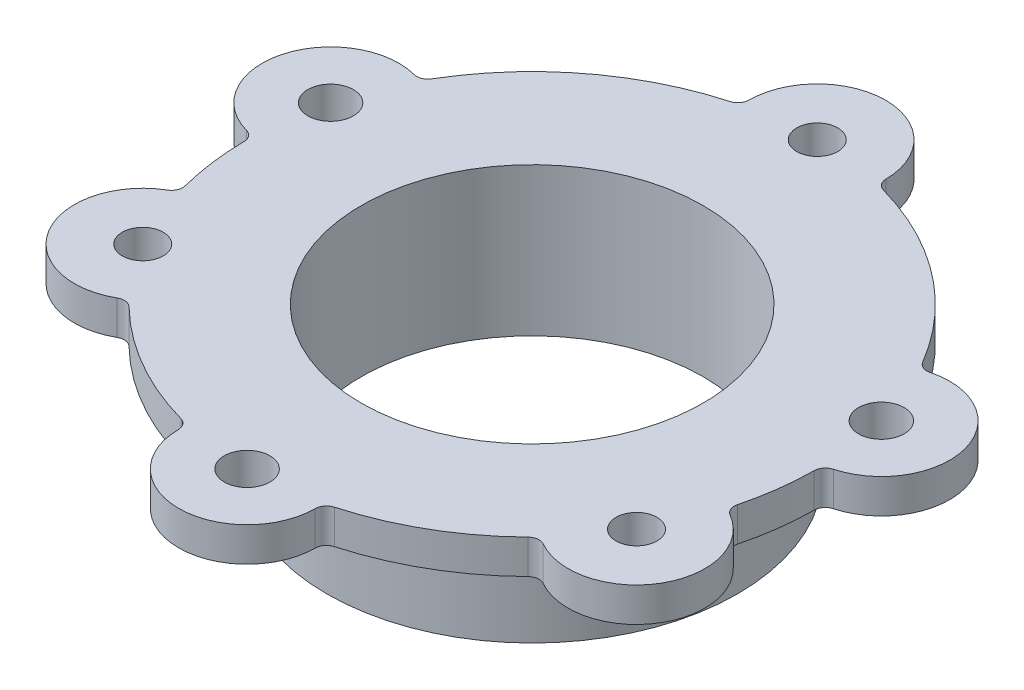
ISO-10303-21;
HEADER;
FILE_DESCRIPTION(('STEP AP214'),'2;1');
FILE_NAME('part.step','',(''),(''),'','','');
FILE_SCHEMA(('AUTOMOTIVE_DESIGN { 1 0 10303 214 1 1 1 1 }'));
ENDSEC;
DATA;
#1=APPLICATION_CONTEXT('core data for automotive mechanical design processes');
#2=APPLICATION_PROTOCOL_DEFINITION('international standard','automotive_design',2000,#1);
#3=PRODUCT_CONTEXT('',#1,'mechanical');
#4=PRODUCT('Part','Part','',(#3));
#5=PRODUCT_RELATED_PRODUCT_CATEGORY('part','',(#4));
#6=PRODUCT_DEFINITION_FORMATION('','',#4);
#7=PRODUCT_DEFINITION_CONTEXT('part definition',#1,'design');
#8=PRODUCT_DEFINITION('design','',#6,#7);
#9=PRODUCT_DEFINITION_SHAPE('','',#8);
#10=(LENGTH_UNIT() NAMED_UNIT(*) SI_UNIT(.MILLI.,.METRE.));
#11=(NAMED_UNIT(*) PLANE_ANGLE_UNIT() SI_UNIT($,.RADIAN.));
#12=(NAMED_UNIT(*) SI_UNIT($,.STERADIAN.) SOLID_ANGLE_UNIT());
#13=UNCERTAINTY_MEASURE_WITH_UNIT(LENGTH_MEASURE(1.E-05),#10,'distance_accuracy_value','');
#14=(GEOMETRIC_REPRESENTATION_CONTEXT(3) GLOBAL_UNCERTAINTY_ASSIGNED_CONTEXT((#13)) GLOBAL_UNIT_ASSIGNED_CONTEXT((#10,
#11,#12)) REPRESENTATION_CONTEXT('',''));
#15=CARTESIAN_POINT('',(0.,0.,0.));
#16=DIRECTION('',(0.,0.,1.));
#17=DIRECTION('',(1.,0.,0.));
#18=AXIS2_PLACEMENT_3D('',#15,#16,#17);
#19=CARTESIAN_POINT('',(0.,0.,0.));
#20=DIRECTION('',(0.,1.,0.));
#21=DIRECTION('',(0.,0.,1.));
#22=AXIS2_PLACEMENT_3D('',#19,#20,#21);
#23=PLANE('',#22);
#24=CARTESIAN_POINT('',(-12.0740728286134,0.,-3.23523806378147));
#25=DIRECTION('',(0.,1.,0.));
#26=DIRECTION('',(0.,0.,1.));
#27=AXIS2_PLACEMENT_3D('',#24,#25,#26);
#28=CIRCLE('',#27,1.);
#29=CARTESIAN_POINT('',(-12.0740728286134,0.,-2.23523806378147));
#30=VERTEX_POINT('',#29);
#31=EDGE_CURVE('E244',#30,#30,#28,.T.);
#32=ORIENTED_EDGE('',*,*,#31,.T.);
#33=EDGE_LOOP('',(#32));
#34=FACE_BOUND('',#33,.T.);
#35=CARTESIAN_POINT('',(0.,0.,-12.5));
#36=DIRECTION('',(0.,1.,0.));
#37=DIRECTION('',(0.,0.,1.));
#38=AXIS2_PLACEMENT_3D('',#35,#36,#37);
#39=CIRCLE('',#38,0.9);
#40=CARTESIAN_POINT('',(0.,0.,-11.6));
#41=VERTEX_POINT('',#40);
#42=EDGE_CURVE('E429',#41,#41,#39,.T.);
#43=ORIENTED_EDGE('',*,*,#42,.T.);
#44=EDGE_LOOP('',(#43));
#45=FACE_BOUND('',#44,.T.);
#46=CARTESIAN_POINT('',(12.0740728286134,0.,-3.23523806378147));
#47=DIRECTION('',(0.,1.,0.));
#48=DIRECTION('',(0.,0.,1.));
#49=AXIS2_PLACEMENT_3D('',#46,#47,#48);
#50=CIRCLE('',#49,1.);
#51=CARTESIAN_POINT('',(12.0740728286134,0.,-2.23523806378147));
#52=VERTEX_POINT('',#51);
#53=EDGE_CURVE('E426',#52,#52,#50,.F.);
#54=ORIENTED_EDGE('',*,*,#53,.F.);
#55=EDGE_LOOP('',(#54));
#56=FACE_BOUND('',#55,.T.);
#57=CARTESIAN_POINT('',(10.8253175473055,0.,6.25000000000006));
#58=DIRECTION('',(0.,1.,0.));
#59=DIRECTION('',(0.,0.,1.));
#60=AXIS2_PLACEMENT_3D('',#57,#58,#59);
#61=CIRCLE('',#60,0.9);
#62=CARTESIAN_POINT('',(10.8253175473055,0.,7.15000000000006));
#63=VERTEX_POINT('',#62);
#64=EDGE_CURVE('E422',#63,#63,#61,.T.);
#65=ORIENTED_EDGE('',*,*,#64,.T.);
#66=EDGE_LOOP('',(#65));
#67=FACE_BOUND('',#66,.T.);
#68=CARTESIAN_POINT('',(-10.8253175473056,0.,6.24999999999991));
#69=DIRECTION('',(0.,1.,0.));
#70=DIRECTION('',(0.,0.,1.));
#71=AXIS2_PLACEMENT_3D('',#68,#69,#70);
#72=CIRCLE('',#71,0.9);
#73=CARTESIAN_POINT('',(-10.8253175473056,0.,7.14999999999991));
#74=VERTEX_POINT('',#73);
#75=EDGE_CURVE('E412',#74,#74,#72,.T.);
#76=ORIENTED_EDGE('',*,*,#75,.T.);
#77=EDGE_LOOP('',(#76));
#78=FACE_BOUND('',#77,.T.);
#79=CARTESIAN_POINT('',(0.,0.,12.5));
#80=DIRECTION('',(0.,1.,0.));
#81=DIRECTION('',(0.,0.,1.));
#82=AXIS2_PLACEMENT_3D('',#79,#80,#81);
#83=CIRCLE('',#82,1.);
#84=CARTESIAN_POINT('',(0.,0.,13.5));
#85=VERTEX_POINT('',#84);
#86=EDGE_CURVE('E406',#85,#85,#83,.T.);
#87=ORIENTED_EDGE('',*,*,#86,.T.);
#88=EDGE_LOOP('',(#87));
#89=FACE_BOUND('',#88,.T.);
#90=CARTESIAN_POINT('',(0.,0.,0.));
#91=DIRECTION('',(0.,1.,0.));
#92=DIRECTION('',(0.,0.,1.));
#93=AXIS2_PLACEMENT_3D('',#90,#91,#92);
#94=CIRCLE('',#93,12.5);
#95=CARTESIAN_POINT('',(3.36532966988113,0.,12.0384615384615));
#96=VERTEX_POINT('',#95);
#97=CARTESIAN_POINT('',(8.74294867984898,0.,8.93369175545737));
#98=VERTEX_POINT('',#97);
#99=EDGE_CURVE('E229',#96,#98,#94,.T.);
#100=ORIENTED_EDGE('',*,*,#99,.F.);
#101=CARTESIAN_POINT('',(3.49994285667638,0.,12.52));
#102=DIRECTION('',(0.,1.,0.));
#103=DIRECTION('',(0.,0.,1.));
#104=AXIS2_PLACEMENT_3D('',#101,#102,#103);
#105=CIRCLE('',#104,0.5);
#106=CARTESIAN_POINT('',(2.99995102000832,0.,12.5171428571429));
#107=VERTEX_POINT('',#106);
#108=EDGE_CURVE('E381',#96,#107,#105,.T.);
#109=ORIENTED_EDGE('',*,*,#108,.T.);
#110=CARTESIAN_POINT('',(0.,0.,12.5));
#111=DIRECTION('',(0.,1.,0.));
#112=DIRECTION('',(0.,0.,1.));
#113=AXIS2_PLACEMENT_3D('',#110,#111,#112);
#114=CIRCLE('',#113,3.);
#115=CARTESIAN_POINT('',(-2.99995102000833,0.,12.5171428571429));
#116=VERTEX_POINT('',#115);
#117=EDGE_CURVE('E402',#116,#107,#114,.T.);
#118=ORIENTED_EDGE('',*,*,#117,.F.);
#119=CARTESIAN_POINT('',(-3.49994285667638,0.,12.52));
#120=DIRECTION('',(0.,1.,0.));
#121=DIRECTION('',(0.,0.,1.));
#122=AXIS2_PLACEMENT_3D('',#119,#120,#121);
#123=CIRCLE('',#122,0.5);
#124=CARTESIAN_POINT('',(-3.36532966988114,0.,12.0384615384615));
#125=VERTEX_POINT('',#124);
#126=EDGE_CURVE('E376',#116,#125,#123,.T.);
#127=ORIENTED_EDGE('',*,*,#126,.T.);
#128=CARTESIAN_POINT('',(0.,0.,0.));
#129=DIRECTION('',(0.,1.,0.));
#130=DIRECTION('',(0.,0.,1.));
#131=AXIS2_PLACEMENT_3D('',#128,#129,#130);
#132=CIRCLE('',#131,12.5);
#133=CARTESIAN_POINT('',(-8.7429486798491,0.,8.93369175545725));
#134=VERTEX_POINT('',#133);
#135=EDGE_CURVE('E407',#134,#125,#132,.T.);
#136=ORIENTED_EDGE('',*,*,#135,.F.);
#137=CARTESIAN_POINT('',(-9.09266662704307,0.,9.29103942567554));
#138=DIRECTION('',(0.,1.,0.));
#139=DIRECTION('',(0.,0.,1.));
#140=AXIS2_PLACEMENT_3D('',#137,#138,#139);
#141=CIRCLE('',#140,0.5);
#142=CARTESIAN_POINT('',(-9.34018818708057,0.,8.8566052220076));
#143=VERTEX_POINT('',#142);
#144=EDGE_CURVE('E370',#134,#143,#141,.T.);
#145=ORIENTED_EDGE('',*,*,#144,.T.);
#146=CARTESIAN_POINT('',(-10.8253175473056,0.,6.24999999999991));
#147=DIRECTION('',(0.,1.,0.));
#148=DIRECTION('',(0.,0.,1.));
#149=AXIS2_PLACEMENT_3D('',#146,#147,#148);
#150=CIRCLE('',#149,3.);
#151=CARTESIAN_POINT('',(-12.3401392070888,0.,3.66053763513507));
#152=VERTEX_POINT('',#151);
#153=EDGE_CURVE('E415',#143,#152,#150,.F.);
#154=ORIENTED_EDGE('',*,*,#153,.T.);
#155=CARTESIAN_POINT('',(-12.5926094837194,0.,3.22896057432427));
#156=DIRECTION('',(0.,1.,0.));
#157=DIRECTION('',(0.,0.,1.));
#158=AXIS2_PLACEMENT_3D('',#155,#156,#157);
#159=CIRCLE('',#158,0.5);
#160=CARTESIAN_POINT('',(-12.1082783497302,0.,3.1047697830041));
#161=VERTEX_POINT('',#160);
#162=EDGE_CURVE('E364',#152,#161,#159,.T.);
#163=ORIENTED_EDGE('',*,*,#162,.T.);
#164=CARTESIAN_POINT('',(0.,0.,0.));
#165=DIRECTION('',(0.,1.,0.));
#166=DIRECTION('',(0.,0.,1.));
#167=AXIS2_PLACEMENT_3D('',#164,#165,#166);
#168=CIRCLE('',#167,12.5);
#169=CARTESIAN_POINT('',(-12.4992723204014,0.,0.134875722227054));
#170=VERTEX_POINT('',#169);
#171=EDGE_CURVE('E572',#170,#161,#168,.T.);
#172=ORIENTED_EDGE('',*,*,#171,.F.);
#173=CARTESIAN_POINT('',(-12.9992432132175,0.,0.140270751116136));
#174=DIRECTION('',(0.,1.,0.));
#175=DIRECTION('',(0.,0.,1.));
#176=AXIS2_PLACEMENT_3D('',#173,#174,#175);
#177=CIRCLE('',#176,0.5);
#178=CARTESIAN_POINT('',(-12.8670760154169,0.,-0.341944793869236));
#179=VERTEX_POINT('',#178);
#180=EDGE_CURVE('E358',#170,#179,#177,.T.);
#181=ORIENTED_EDGE('',*,*,#180,.T.);
#182=CARTESIAN_POINT('',(-12.0740728286134,0.,-3.23523806378147));
#183=DIRECTION('',(0.,1.,0.));
#184=DIRECTION('',(0.,0.,1.));
#185=AXIS2_PLACEMENT_3D('',#182,#183,#184);
#186=CIRCLE('',#185,3.);
#187=CARTESIAN_POINT('',(-11.3141870987112,0.,-6.13740512952579));
#188=VERTEX_POINT('',#187);
#189=EDGE_CURVE('E568',#188,#179,#186,.T.);
#190=ORIENTED_EDGE('',*,*,#189,.F.);
#191=CARTESIAN_POINT('',(-11.1875394770608,0.,-6.62109964048318));
#192=DIRECTION('',(0.,1.,0.));
#193=DIRECTION('',(0.,0.,1.));
#194=AXIS2_PLACEMENT_3D('',#191,#192,#193);
#195=CIRCLE('',#194,0.5);
#196=CARTESIAN_POINT('',(-10.7572494971738,0.,-6.36644196200305));
#197=VERTEX_POINT('',#196);
#198=EDGE_CURVE('E352',#188,#197,#195,.T.);
#199=ORIENTED_EDGE('',*,*,#198,.T.);
#200=CARTESIAN_POINT('',(0.,0.,0.));
#201=DIRECTION('',(0.,1.,0.));
#202=DIRECTION('',(0.,0.,1.));
#203=AXIS2_PLACEMENT_3D('',#200,#201,#202);
#204=CIRCLE('',#203,12.5);
#205=CARTESIAN_POINT('',(-3.36532966988114,0.,-12.0384615384615));
#206=VERTEX_POINT('',#205);
#207=EDGE_CURVE('E564',#206,#197,#204,.T.);
#208=ORIENTED_EDGE('',*,*,#207,.F.);
#209=CARTESIAN_POINT('',(-3.49994285667639,0.,-12.52));
#210=DIRECTION('',(0.,1.,0.));
#211=DIRECTION('',(0.,0.,1.));
#212=AXIS2_PLACEMENT_3D('',#209,#210,#211);
#213=CIRCLE('',#212,0.5);
#214=CARTESIAN_POINT('',(-2.99995102000833,0.,-12.5171428571429));
#215=VERTEX_POINT('',#214);
#216=EDGE_CURVE('E346',#206,#215,#213,.T.);
#217=ORIENTED_EDGE('',*,*,#216,.T.);
#218=CARTESIAN_POINT('',(0.,0.,-12.5));
#219=DIRECTION('',(0.,1.,0.));
#220=DIRECTION('',(0.,0.,1.));
#221=AXIS2_PLACEMENT_3D('',#218,#219,#220);
#222=CIRCLE('',#221,3.);
#223=CARTESIAN_POINT('',(2.99995102000832,0.,-12.5171428571429));
#224=VERTEX_POINT('',#223);
#225=EDGE_CURVE('E560',#215,#224,#222,.F.);
#226=ORIENTED_EDGE('',*,*,#225,.T.);
#227=CARTESIAN_POINT('',(3.49994285667637,0.,-12.52));
#228=DIRECTION('',(0.,1.,0.));
#229=DIRECTION('',(0.,0.,1.));
#230=AXIS2_PLACEMENT_3D('',#227,#228,#229);
#231=CIRCLE('',#230,0.5);
#232=CARTESIAN_POINT('',(3.36532966988113,0.,-12.0384615384615));
#233=VERTEX_POINT('',#232);
#234=EDGE_CURVE('E340',#224,#233,#231,.T.);
#235=ORIENTED_EDGE('',*,*,#234,.T.);
#236=CARTESIAN_POINT('',(0.,0.,0.));
#237=DIRECTION('',(0.,1.,0.));
#238=DIRECTION('',(0.,0.,1.));
#239=AXIS2_PLACEMENT_3D('',#236,#237,#238);
#240=CIRCLE('',#239,12.5);
#241=CARTESIAN_POINT('',(10.7572494971738,0.,-6.36644196200305));
#242=VERTEX_POINT('',#241);
#243=EDGE_CURVE('E556',#242,#233,#240,.T.);
#244=ORIENTED_EDGE('',*,*,#243,.F.);
#245=CARTESIAN_POINT('',(11.1875394770608,0.,-6.62109964048317));
#246=DIRECTION('',(0.,1.,0.));
#247=DIRECTION('',(0.,0.,1.));
#248=AXIS2_PLACEMENT_3D('',#245,#246,#247);
#249=CIRCLE('',#248,0.5);
#250=CARTESIAN_POINT('',(11.3141870987112,0.,-6.13740512952579));
#251=VERTEX_POINT('',#250);
#252=EDGE_CURVE('E334',#242,#251,#249,.T.);
#253=ORIENTED_EDGE('',*,*,#252,.T.);
#254=CARTESIAN_POINT('',(12.0740728286134,0.,-3.23523806378147));
#255=DIRECTION('',(0.,1.,0.));
#256=DIRECTION('',(0.,0.,1.));
#257=AXIS2_PLACEMENT_3D('',#254,#255,#256);
#258=CIRCLE('',#257,3.);
#259=CARTESIAN_POINT('',(12.8670760154169,0.,-0.341944793869236));
#260=VERTEX_POINT('',#259);
#261=EDGE_CURVE('E552',#251,#260,#258,.F.);
#262=ORIENTED_EDGE('',*,*,#261,.T.);
#263=CARTESIAN_POINT('',(12.9992432132175,0.,0.140270751116136));
#264=DIRECTION('',(0.,1.,0.));
#265=DIRECTION('',(0.,0.,1.));
#266=AXIS2_PLACEMENT_3D('',#263,#264,#265);
#267=CIRCLE('',#266,0.5);
#268=CARTESIAN_POINT('',(12.4992723204014,0.,0.134875722227054));
#269=VERTEX_POINT('',#268);
#270=EDGE_CURVE('E328',#260,#269,#267,.T.);
#271=ORIENTED_EDGE('',*,*,#270,.T.);
#272=CARTESIAN_POINT('',(0.,0.,0.));
#273=DIRECTION('',(0.,1.,0.));
#274=DIRECTION('',(0.,0.,1.));
#275=AXIS2_PLACEMENT_3D('',#272,#273,#274);
#276=CIRCLE('',#275,12.5);
#277=CARTESIAN_POINT('',(12.1082783497301,0.,3.10476978300426));
#278=VERTEX_POINT('',#277);
#279=EDGE_CURVE('E211',#278,#269,#276,.T.);
#280=ORIENTED_EDGE('',*,*,#279,.F.);
#281=CARTESIAN_POINT('',(12.5926094837193,0.,3.22896057432443));
#282=DIRECTION('',(0.,1.,0.));
#283=DIRECTION('',(0.,0.,1.));
#284=AXIS2_PLACEMENT_3D('',#281,#282,#283);
#285=CIRCLE('',#284,0.5);
#286=CARTESIAN_POINT('',(12.3401392070888,0.,3.66053763513523));
#287=VERTEX_POINT('',#286);
#288=EDGE_CURVE('E205',#278,#287,#285,.T.);
#289=ORIENTED_EDGE('',*,*,#288,.T.);
#290=CARTESIAN_POINT('',(10.8253175473055,0.,6.25000000000006));
#291=DIRECTION('',(0.,1.,0.));
#292=DIRECTION('',(0.,0.,1.));
#293=AXIS2_PLACEMENT_3D('',#290,#291,#292);
#294=CIRCLE('',#293,3.);
#295=CARTESIAN_POINT('',(9.34018818708045,0.,8.85660522200772));
#296=VERTEX_POINT('',#295);
#297=EDGE_CURVE('E209',#287,#296,#294,.F.);
#298=ORIENTED_EDGE('',*,*,#297,.T.);
#299=CARTESIAN_POINT('',(9.09266662704294,0.,9.29103942567566));
#300=DIRECTION('',(0.,1.,0.));
#301=DIRECTION('',(0.,0.,1.));
#302=AXIS2_PLACEMENT_3D('',#299,#300,#301);
#303=CIRCLE('',#302,0.5);
#304=EDGE_CURVE('E321',#296,#98,#303,.T.);
#305=ORIENTED_EDGE('',*,*,#304,.T.);
#306=EDGE_LOOP('',(#100,#109,#118,#127,#136,#145,#154,#163,#172,#181,#190,#199,#208,#217,#226,
#235,#244,#253,#262,#271,#280,#289,#298,#305));
#307=FACE_BOUND('',#306,.T.);
#308=CARTESIAN_POINT('',(0.,0.,0.));
#309=DIRECTION('',(0.,1.,0.));
#310=DIRECTION('',(0.,0.,1.));
#311=AXIS2_PLACEMENT_3D('',#308,#309,#310);
#312=CIRCLE('',#311,9.);
#313=CARTESIAN_POINT('',(0.,0.,9.));
#314=VERTEX_POINT('',#313);
#315=EDGE_CURVE('E11',#314,#314,#312,.F.);
#316=ORIENTED_EDGE('',*,*,#315,.F.);
#317=EDGE_LOOP('',(#316));
#318=FACE_BOUND('',#317,.T.);
#319=ADVANCED_FACE('F41',(#34,#45,#56,#67,#78,#89,#307,#318),#23,.F.);
#320=CARTESIAN_POINT('',(0.,1.5,0.));
#321=DIRECTION('',(0.,-1.,0.));
#322=DIRECTION('',(0.,0.,-1.));
#323=AXIS2_PLACEMENT_3D('',#320,#321,#322);
#324=CYLINDRICAL_SURFACE('',#323,12.5);
#325=ORIENTED_EDGE('',*,*,#99,.T.);
#326=DIRECTION('',(0.,-1.,0.));
#327=VECTOR('',#326,1.);
#328=CARTESIAN_POINT('',(8.74294867984898,1.5,8.93369175545737));
#329=LINE('',#328,#327);
#330=CARTESIAN_POINT('',(8.74294867984898,1.5,8.93369175545737));
#331=VERTEX_POINT('',#330);
#332=EDGE_CURVE('E250',#98,#331,#329,.F.);
#333=ORIENTED_EDGE('',*,*,#332,.T.);
#334=CARTESIAN_POINT('',(0.,1.5,0.));
#335=DIRECTION('',(0.,1.,0.));
#336=DIRECTION('',(0.,0.,1.));
#337=AXIS2_PLACEMENT_3D('',#334,#335,#336);
#338=CIRCLE('',#337,12.5);
#339=CARTESIAN_POINT('',(3.36532966988113,1.5,12.0384615384615));
#340=VERTEX_POINT('',#339);
#341=EDGE_CURVE('E389',#340,#331,#338,.T.);
#342=ORIENTED_EDGE('',*,*,#341,.F.);
#343=DIRECTION('',(0.,-1.,0.));
#344=VECTOR('',#343,1.);
#345=CARTESIAN_POINT('',(3.36532966988113,1.5,12.0384615384615));
#346=LINE('',#345,#344);
#347=EDGE_CURVE('E238',#340,#96,#346,.T.);
#348=ORIENTED_EDGE('',*,*,#347,.T.);
#349=EDGE_LOOP('',(#325,#333,#342,#348));
#350=FACE_BOUND('',#349,.T.);
#351=ADVANCED_FACE('F396',(#350),#324,.T.);
#352=CARTESIAN_POINT('',(10.8253175473055,1.5,6.25000000000006));
#353=DIRECTION('',(0.,-1.,0.));
#354=DIRECTION('',(0.,0.,-1.));
#355=AXIS2_PLACEMENT_3D('',#352,#353,#354);
#356=CYLINDRICAL_SURFACE('',#355,3.);
#357=CARTESIAN_POINT('',(10.8253175473055,1.5,6.25000000000006));
#358=DIRECTION('',(0.,1.,0.));
#359=DIRECTION('',(0.,0.,1.));
#360=AXIS2_PLACEMENT_3D('',#357,#358,#359);
#361=CIRCLE('',#360,3.);
#362=CARTESIAN_POINT('',(12.3401392070888,1.5,3.66053763513523));
#363=VERTEX_POINT('',#362);
#364=CARTESIAN_POINT('',(9.34018818708045,1.5,8.85660522200772));
#365=VERTEX_POINT('',#364);
#366=EDGE_CURVE('E399',#363,#365,#361,.F.);
#367=ORIENTED_EDGE('',*,*,#366,.T.);
#368=DIRECTION('',(0.,-1.,0.));
#369=VECTOR('',#368,1.);
#370=CARTESIAN_POINT('',(9.34018818708045,1.5,8.85660522200772));
#371=LINE('',#370,#369);
#372=EDGE_CURVE('E227',#365,#296,#371,.T.);
#373=ORIENTED_EDGE('',*,*,#372,.T.);
#374=ORIENTED_EDGE('',*,*,#297,.F.);
#375=DIRECTION('',(0.,-1.,0.));
#376=VECTOR('',#375,1.);
#377=CARTESIAN_POINT('',(12.3401392070888,1.5,3.66053763513523));
#378=LINE('',#377,#376);
#379=EDGE_CURVE('E224',#287,#363,#378,.F.);
#380=ORIENTED_EDGE('',*,*,#379,.T.);
#381=EDGE_LOOP('',(#367,#373,#374,#380));
#382=FACE_BOUND('',#381,.T.);
#383=ADVANCED_FACE('F223',(#382),#356,.T.);
#384=CARTESIAN_POINT('',(0.,1.5,0.));
#385=DIRECTION('',(0.,-1.,0.));
#386=DIRECTION('',(0.,0.,-1.));
#387=AXIS2_PLACEMENT_3D('',#384,#385,#386);
#388=CYLINDRICAL_SURFACE('',#387,12.5);
#389=CARTESIAN_POINT('',(0.,1.5,0.));
#390=DIRECTION('',(0.,1.,0.));
#391=DIRECTION('',(0.,0.,1.));
#392=AXIS2_PLACEMENT_3D('',#389,#390,#391);
#393=CIRCLE('',#392,12.5);
#394=CARTESIAN_POINT('',(12.1082783497301,1.5,3.10476978300426));
#395=VERTEX_POINT('',#394);
#396=CARTESIAN_POINT('',(12.4992723204014,1.5,0.134875722227054));
#397=VERTEX_POINT('',#396);
#398=EDGE_CURVE('E488',#395,#397,#393,.T.);
#399=ORIENTED_EDGE('',*,*,#398,.F.);
#400=DIRECTION('',(0.,-1.,0.));
#401=VECTOR('',#400,1.);
#402=CARTESIAN_POINT('',(12.1082783497301,1.5,3.10476978300426));
#403=LINE('',#402,#401);
#404=EDGE_CURVE('E256',#395,#278,#403,.T.);
#405=ORIENTED_EDGE('',*,*,#404,.T.);
#406=ORIENTED_EDGE('',*,*,#279,.T.);
#407=DIRECTION('',(0.,-1.,0.));
#408=VECTOR('',#407,1.);
#409=CARTESIAN_POINT('',(12.4992723204014,1.5,0.134875722227054));
#410=LINE('',#409,#408);
#411=EDGE_CURVE('E253',#269,#397,#410,.F.);
#412=ORIENTED_EDGE('',*,*,#411,.T.);
#413=EDGE_LOOP('',(#399,#405,#406,#412));
#414=FACE_BOUND('',#413,.T.);
#415=ADVANCED_FACE('F635',(#414),#388,.T.);
#416=CARTESIAN_POINT('',(12.0740728286134,1.5,-3.23523806378147));
#417=DIRECTION('',(0.,-1.,0.));
#418=DIRECTION('',(0.,0.,-1.));
#419=AXIS2_PLACEMENT_3D('',#416,#417,#418);
#420=CYLINDRICAL_SURFACE('',#419,3.);
#421=CARTESIAN_POINT('',(12.0740728286134,1.5,-3.23523806378147));
#422=DIRECTION('',(0.,1.,0.));
#423=DIRECTION('',(0.,0.,1.));
#424=AXIS2_PLACEMENT_3D('',#421,#422,#423);
#425=CIRCLE('',#424,3.);
#426=CARTESIAN_POINT('',(11.3141870987112,1.5,-6.13740512952579));
#427=VERTEX_POINT('',#426);
#428=CARTESIAN_POINT('',(12.8670760154169,1.5,-0.341944793869236));
#429=VERTEX_POINT('',#428);
#430=EDGE_CURVE('E492',#427,#429,#425,.F.);
#431=ORIENTED_EDGE('',*,*,#430,.T.);
#432=DIRECTION('',(0.,-1.,0.));
#433=VECTOR('',#432,1.);
#434=CARTESIAN_POINT('',(12.8670760154169,1.5,-0.341944793869235));
#435=LINE('',#434,#433);
#436=EDGE_CURVE('E262',#429,#260,#435,.T.);
#437=ORIENTED_EDGE('',*,*,#436,.T.);
#438=ORIENTED_EDGE('',*,*,#261,.F.);
#439=DIRECTION('',(0.,-1.,0.));
#440=VECTOR('',#439,1.);
#441=CARTESIAN_POINT('',(11.3141870987112,1.5,-6.13740512952579));
#442=LINE('',#441,#440);
#443=EDGE_CURVE('E259',#251,#427,#442,.F.);
#444=ORIENTED_EDGE('',*,*,#443,.T.);
#445=EDGE_LOOP('',(#431,#437,#438,#444));
#446=FACE_BOUND('',#445,.T.);
#447=ADVANCED_FACE('F638',(#446),#420,.T.);
#448=CARTESIAN_POINT('',(0.,1.5,0.));
#449=DIRECTION('',(0.,-1.,0.));
#450=DIRECTION('',(0.,0.,-1.));
#451=AXIS2_PLACEMENT_3D('',#448,#449,#450);
#452=CYLINDRICAL_SURFACE('',#451,12.5);
#453=CARTESIAN_POINT('',(0.,1.5,0.));
#454=DIRECTION('',(0.,1.,0.));
#455=DIRECTION('',(0.,0.,1.));
#456=AXIS2_PLACEMENT_3D('',#453,#454,#455);
#457=CIRCLE('',#456,12.5);
#458=CARTESIAN_POINT('',(10.7572494971738,1.5,-6.36644196200305));
#459=VERTEX_POINT('',#458);
#460=CARTESIAN_POINT('',(3.36532966988113,1.5,-12.0384615384615));
#461=VERTEX_POINT('',#460);
#462=EDGE_CURVE('E496',#459,#461,#457,.T.);
#463=ORIENTED_EDGE('',*,*,#462,.F.);
#464=DIRECTION('',(0.,-1.,0.));
#465=VECTOR('',#464,1.);
#466=CARTESIAN_POINT('',(10.7572494971738,1.5,-6.36644196200305));
#467=LINE('',#466,#465);
#468=EDGE_CURVE('E269',#459,#242,#467,.T.);
#469=ORIENTED_EDGE('',*,*,#468,.T.);
#470=ORIENTED_EDGE('',*,*,#243,.T.);
#471=DIRECTION('',(0.,-1.,0.));
#472=VECTOR('',#471,1.);
#473=CARTESIAN_POINT('',(3.36532966988113,1.5,-12.0384615384615));
#474=LINE('',#473,#472);
#475=EDGE_CURVE('E266',#233,#461,#474,.F.);
#476=ORIENTED_EDGE('',*,*,#475,.T.);
#477=EDGE_LOOP('',(#463,#469,#470,#476));
#478=FACE_BOUND('',#477,.T.);
#479=ADVANCED_FACE('F642',(#478),#452,.T.);
#480=CARTESIAN_POINT('',(0.,1.5,-12.5));
#481=DIRECTION('',(0.,-1.,0.));
#482=DIRECTION('',(0.,0.,-1.));
#483=AXIS2_PLACEMENT_3D('',#480,#481,#482);
#484=CYLINDRICAL_SURFACE('',#483,3.);
#485=CARTESIAN_POINT('',(0.,1.5,-12.5));
#486=DIRECTION('',(0.,1.,0.));
#487=DIRECTION('',(0.,0.,1.));
#488=AXIS2_PLACEMENT_3D('',#485,#486,#487);
#489=CIRCLE('',#488,3.);
#490=CARTESIAN_POINT('',(-2.99995102000833,1.5,-12.5171428571429));
#491=VERTEX_POINT('',#490);
#492=CARTESIAN_POINT('',(2.99995102000832,1.5,-12.5171428571429));
#493=VERTEX_POINT('',#492);
#494=EDGE_CURVE('E500',#491,#493,#489,.F.);
#495=ORIENTED_EDGE('',*,*,#494,.T.);
#496=DIRECTION('',(0.,-1.,0.));
#497=VECTOR('',#496,1.);
#498=CARTESIAN_POINT('',(2.99995102000832,1.5,-12.5171428571429));
#499=LINE('',#498,#497);
#500=EDGE_CURVE('E276',#493,#224,#499,.T.);
#501=ORIENTED_EDGE('',*,*,#500,.T.);
#502=ORIENTED_EDGE('',*,*,#225,.F.);
#503=DIRECTION('',(0.,-1.,0.));
#504=VECTOR('',#503,1.);
#505=CARTESIAN_POINT('',(-2.99995102000833,1.5,-12.5171428571429));
#506=LINE('',#505,#504);
#507=EDGE_CURVE('E273',#215,#491,#506,.F.);
#508=ORIENTED_EDGE('',*,*,#507,.T.);
#509=EDGE_LOOP('',(#495,#501,#502,#508));
#510=FACE_BOUND('',#509,.T.);
#511=ADVANCED_FACE('F646',(#510),#484,.T.);
#512=CARTESIAN_POINT('',(0.,1.5,0.));
#513=DIRECTION('',(0.,-1.,0.));
#514=DIRECTION('',(0.,0.,-1.));
#515=AXIS2_PLACEMENT_3D('',#512,#513,#514);
#516=CYLINDRICAL_SURFACE('',#515,12.5);
#517=CARTESIAN_POINT('',(0.,1.5,0.));
#518=DIRECTION('',(0.,1.,0.));
#519=DIRECTION('',(0.,0.,1.));
#520=AXIS2_PLACEMENT_3D('',#517,#518,#519);
#521=CIRCLE('',#520,12.5);
#522=CARTESIAN_POINT('',(-3.36532966988114,1.5,-12.0384615384615));
#523=VERTEX_POINT('',#522);
#524=CARTESIAN_POINT('',(-10.7572494971738,1.5,-6.36644196200305));
#525=VERTEX_POINT('',#524);
#526=EDGE_CURVE('E504',#523,#525,#521,.T.);
#527=ORIENTED_EDGE('',*,*,#526,.F.);
#528=DIRECTION('',(0.,-1.,0.));
#529=VECTOR('',#528,1.);
#530=CARTESIAN_POINT('',(-3.36532966988114,1.5,-12.0384615384615));
#531=LINE('',#530,#529);
#532=EDGE_CURVE('E283',#523,#206,#531,.T.);
#533=ORIENTED_EDGE('',*,*,#532,.T.);
#534=ORIENTED_EDGE('',*,*,#207,.T.);
#535=DIRECTION('',(0.,-1.,0.));
#536=VECTOR('',#535,1.);
#537=CARTESIAN_POINT('',(-10.7572494971738,1.5,-6.36644196200305));
#538=LINE('',#537,#536);
#539=EDGE_CURVE('E280',#197,#525,#538,.F.);
#540=ORIENTED_EDGE('',*,*,#539,.T.);
#541=EDGE_LOOP('',(#527,#533,#534,#540));
#542=FACE_BOUND('',#541,.T.);
#543=ADVANCED_FACE('F650',(#542),#516,.T.);
#544=CARTESIAN_POINT('',(-12.0740728286134,1.5,-3.23523806378147));
#545=DIRECTION('',(0.,-1.,0.));
#546=DIRECTION('',(0.,0.,-1.));
#547=AXIS2_PLACEMENT_3D('',#544,#545,#546);
#548=CYLINDRICAL_SURFACE('',#547,3.);
#549=CARTESIAN_POINT('',(-12.0740728286134,1.5,-3.23523806378147));
#550=DIRECTION('',(0.,1.,0.));
#551=DIRECTION('',(0.,0.,1.));
#552=AXIS2_PLACEMENT_3D('',#549,#550,#551);
#553=CIRCLE('',#552,3.);
#554=CARTESIAN_POINT('',(-11.3141870987112,1.5,-6.13740512952579));
#555=VERTEX_POINT('',#554);
#556=CARTESIAN_POINT('',(-12.8670760154169,1.5,-0.341944793869236));
#557=VERTEX_POINT('',#556);
#558=EDGE_CURVE('E508',#555,#557,#553,.T.);
#559=ORIENTED_EDGE('',*,*,#558,.F.);
#560=DIRECTION('',(0.,-1.,0.));
#561=VECTOR('',#560,1.);
#562=CARTESIAN_POINT('',(-11.3141870987112,1.5,-6.13740512952579));
#563=LINE('',#562,#561);
#564=EDGE_CURVE('E290',#555,#188,#563,.T.);
#565=ORIENTED_EDGE('',*,*,#564,.T.);
#566=ORIENTED_EDGE('',*,*,#189,.T.);
#567=DIRECTION('',(0.,-1.,0.));
#568=VECTOR('',#567,1.);
#569=CARTESIAN_POINT('',(-12.8670760154169,1.5,-0.341944793869236));
#570=LINE('',#569,#568);
#571=EDGE_CURVE('E287',#179,#557,#570,.F.);
#572=ORIENTED_EDGE('',*,*,#571,.T.);
#573=EDGE_LOOP('',(#559,#565,#566,#572));
#574=FACE_BOUND('',#573,.T.);
#575=ADVANCED_FACE('F654',(#574),#548,.T.);
#576=CARTESIAN_POINT('',(0.,1.5,0.));
#577=DIRECTION('',(0.,-1.,0.));
#578=DIRECTION('',(0.,0.,-1.));
#579=AXIS2_PLACEMENT_3D('',#576,#577,#578);
#580=CYLINDRICAL_SURFACE('',#579,12.5);
#581=CARTESIAN_POINT('',(0.,1.5,0.));
#582=DIRECTION('',(0.,1.,0.));
#583=DIRECTION('',(0.,0.,1.));
#584=AXIS2_PLACEMENT_3D('',#581,#582,#583);
#585=CIRCLE('',#584,12.5);
#586=CARTESIAN_POINT('',(-12.4992723204014,1.5,0.134875722227054));
#587=VERTEX_POINT('',#586);
#588=CARTESIAN_POINT('',(-12.1082783497302,1.5,3.1047697830041));
#589=VERTEX_POINT('',#588);
#590=EDGE_CURVE('E512',#587,#589,#585,.T.);
#591=ORIENTED_EDGE('',*,*,#590,.F.);
#592=DIRECTION('',(0.,-1.,0.));
#593=VECTOR('',#592,1.);
#594=CARTESIAN_POINT('',(-12.4992723204014,1.5,0.134875722227054));
#595=LINE('',#594,#593);
#596=EDGE_CURVE('E297',#587,#170,#595,.T.);
#597=ORIENTED_EDGE('',*,*,#596,.T.);
#598=ORIENTED_EDGE('',*,*,#171,.T.);
#599=DIRECTION('',(0.,-1.,0.));
#600=VECTOR('',#599,1.);
#601=CARTESIAN_POINT('',(-12.1082783497302,1.5,3.1047697830041));
#602=LINE('',#601,#600);
#603=EDGE_CURVE('E294',#161,#589,#602,.F.);
#604=ORIENTED_EDGE('',*,*,#603,.T.);
#605=EDGE_LOOP('',(#591,#597,#598,#604));
#606=FACE_BOUND('',#605,.T.);
#607=ADVANCED_FACE('F658',(#606),#580,.T.);
#608=CARTESIAN_POINT('',(-10.8253175473056,1.5,6.24999999999991));
#609=DIRECTION('',(0.,-1.,0.));
#610=DIRECTION('',(0.,0.,-1.));
#611=AXIS2_PLACEMENT_3D('',#608,#609,#610);
#612=CYLINDRICAL_SURFACE('',#611,3.);
#613=CARTESIAN_POINT('',(-10.8253175473056,1.5,6.24999999999991));
#614=DIRECTION('',(0.,1.,0.));
#615=DIRECTION('',(0.,0.,1.));
#616=AXIS2_PLACEMENT_3D('',#613,#614,#615);
#617=CIRCLE('',#616,3.);
#618=CARTESIAN_POINT('',(-9.34018818708057,1.5,8.8566052220076));
#619=VERTEX_POINT('',#618);
#620=CARTESIAN_POINT('',(-12.3401392070888,1.5,3.66053763513507));
#621=VERTEX_POINT('',#620);
#622=EDGE_CURVE('E516',#619,#621,#617,.F.);
#623=ORIENTED_EDGE('',*,*,#622,.T.);
#624=DIRECTION('',(0.,-1.,0.));
#625=VECTOR('',#624,1.);
#626=CARTESIAN_POINT('',(-12.3401392070888,1.5,3.66053763513507));
#627=LINE('',#626,#625);
#628=EDGE_CURVE('E304',#621,#152,#627,.T.);
#629=ORIENTED_EDGE('',*,*,#628,.T.);
#630=ORIENTED_EDGE('',*,*,#153,.F.);
#631=DIRECTION('',(0.,-1.,0.));
#632=VECTOR('',#631,1.);
#633=CARTESIAN_POINT('',(-9.34018818708057,1.5,8.8566052220076));
#634=LINE('',#633,#632);
#635=EDGE_CURVE('E301',#143,#619,#634,.F.);
#636=ORIENTED_EDGE('',*,*,#635,.T.);
#637=EDGE_LOOP('',(#623,#629,#630,#636));
#638=FACE_BOUND('',#637,.T.);
#639=ADVANCED_FACE('F582',(#638),#612,.T.);
#640=CARTESIAN_POINT('',(0.,1.5,0.));
#641=DIRECTION('',(0.,-1.,0.));
#642=DIRECTION('',(0.,0.,-1.));
#643=AXIS2_PLACEMENT_3D('',#640,#641,#642);
#644=CYLINDRICAL_SURFACE('',#643,12.5);
#645=CARTESIAN_POINT('',(0.,1.5,0.));
#646=DIRECTION('',(0.,1.,0.));
#647=DIRECTION('',(0.,0.,1.));
#648=AXIS2_PLACEMENT_3D('',#645,#646,#647);
#649=CIRCLE('',#648,12.5);
#650=CARTESIAN_POINT('',(-8.7429486798491,1.5,8.93369175545725));
#651=VERTEX_POINT('',#650);
#652=CARTESIAN_POINT('',(-3.36532966988114,1.5,12.0384615384615));
#653=VERTEX_POINT('',#652);
#654=EDGE_CURVE('E520',#651,#653,#649,.T.);
#655=ORIENTED_EDGE('',*,*,#654,.F.);
#656=DIRECTION('',(0.,-1.,0.));
#657=VECTOR('',#656,1.);
#658=CARTESIAN_POINT('',(-8.7429486798491,1.5,8.93369175545725));
#659=LINE('',#658,#657);
#660=EDGE_CURVE('E311',#651,#134,#659,.T.);
#661=ORIENTED_EDGE('',*,*,#660,.T.);
#662=ORIENTED_EDGE('',*,*,#135,.T.);
#663=DIRECTION('',(0.,-1.,0.));
#664=VECTOR('',#663,1.);
#665=CARTESIAN_POINT('',(-3.36532966988114,1.5,12.0384615384615));
#666=LINE('',#665,#664);
#667=EDGE_CURVE('E308',#125,#653,#666,.F.);
#668=ORIENTED_EDGE('',*,*,#667,.T.);
#669=EDGE_LOOP('',(#655,#661,#662,#668));
#670=FACE_BOUND('',#669,.T.);
#671=ADVANCED_FACE('F591',(#670),#644,.T.);
#672=CARTESIAN_POINT('',(0.,1.5,-12.5));
#673=DIRECTION('',(0.,-1.,0.));
#674=DIRECTION('',(0.,0.,-1.));
#675=AXIS2_PLACEMENT_3D('',#672,#673,#674);
#676=CYLINDRICAL_SURFACE('',#675,0.9);
#677=CARTESIAN_POINT('',(0.,1.5,-12.5));
#678=DIRECTION('',(0.,1.,0.));
#679=DIRECTION('',(0.,0.,1.));
#680=AXIS2_PLACEMENT_3D('',#677,#678,#679);
#681=CIRCLE('',#680,0.9);
#682=CARTESIAN_POINT('',(0.,1.5,-11.6));
#683=VERTEX_POINT('',#682);
#684=EDGE_CURVE('E241',#683,#683,#681,.T.);
#685=ORIENTED_EDGE('',*,*,#684,.T.);
#686=EDGE_LOOP('',(#685));
#687=FACE_BOUND('',#686,.T.);
#688=ORIENTED_EDGE('',*,*,#42,.F.);
#689=EDGE_LOOP('',(#688));
#690=FACE_BOUND('',#689,.T.);
#691=ADVANCED_FACE('F666',(#687,#690),#676,.F.);
#692=CARTESIAN_POINT('',(12.0740728286134,1.5,-3.23523806378147));
#693=DIRECTION('',(0.,-1.,0.));
#694=DIRECTION('',(0.,0.,-1.));
#695=AXIS2_PLACEMENT_3D('',#692,#693,#694);
#696=CYLINDRICAL_SURFACE('',#695,1.);
#697=CARTESIAN_POINT('',(12.0740728286134,1.5,-3.23523806378147));
#698=DIRECTION('',(0.,1.,0.));
#699=DIRECTION('',(0.,0.,1.));
#700=AXIS2_PLACEMENT_3D('',#697,#698,#699);
#701=CIRCLE('',#700,1.);
#702=CARTESIAN_POINT('',(12.0740728286134,1.5,-2.23523806378147));
#703=VERTEX_POINT('',#702);
#704=EDGE_CURVE('E541',#703,#703,#701,.F.);
#705=ORIENTED_EDGE('',*,*,#704,.F.);
#706=EDGE_LOOP('',(#705));
#707=FACE_BOUND('',#706,.T.);
#708=ORIENTED_EDGE('',*,*,#53,.T.);
#709=EDGE_LOOP('',(#708));
#710=FACE_BOUND('',#709,.T.);
#711=ADVANCED_FACE('F681',(#707,#710),#696,.F.);
#712=CARTESIAN_POINT('',(10.8253175473055,1.5,6.25000000000006));
#713=DIRECTION('',(0.,-1.,0.));
#714=DIRECTION('',(0.,0.,-1.));
#715=AXIS2_PLACEMENT_3D('',#712,#713,#714);
#716=CYLINDRICAL_SURFACE('',#715,0.9);
#717=CARTESIAN_POINT('',(10.8253175473055,1.5,6.25000000000006));
#718=DIRECTION('',(0.,1.,0.));
#719=DIRECTION('',(0.,0.,1.));
#720=AXIS2_PLACEMENT_3D('',#717,#718,#719);
#721=CIRCLE('',#720,0.9);
#722=CARTESIAN_POINT('',(10.8253175473055,1.5,7.15000000000006));
#723=VERTEX_POINT('',#722);
#724=EDGE_CURVE('E537',#723,#723,#721,.T.);
#725=ORIENTED_EDGE('',*,*,#724,.T.);
#726=EDGE_LOOP('',(#725));
#727=FACE_BOUND('',#726,.T.);
#728=ORIENTED_EDGE('',*,*,#64,.F.);
#729=EDGE_LOOP('',(#728));
#730=FACE_BOUND('',#729,.T.);
#731=ADVANCED_FACE('F677',(#727,#730),#716,.F.);
#732=CARTESIAN_POINT('',(-10.8253175473056,1.5,6.24999999999991));
#733=DIRECTION('',(0.,-1.,0.));
#734=DIRECTION('',(0.,0.,-1.));
#735=AXIS2_PLACEMENT_3D('',#732,#733,#734);
#736=CYLINDRICAL_SURFACE('',#735,0.9);
#737=CARTESIAN_POINT('',(-10.8253175473056,1.5,6.24999999999991));
#738=DIRECTION('',(0.,1.,0.));
#739=DIRECTION('',(0.,0.,1.));
#740=AXIS2_PLACEMENT_3D('',#737,#738,#739);
#741=CIRCLE('',#740,0.9);
#742=CARTESIAN_POINT('',(-10.8253175473056,1.5,7.14999999999991));
#743=VERTEX_POINT('',#742);
#744=EDGE_CURVE('E533',#743,#743,#741,.T.);
#745=ORIENTED_EDGE('',*,*,#744,.T.);
#746=EDGE_LOOP('',(#745));
#747=FACE_BOUND('',#746,.T.);
#748=ORIENTED_EDGE('',*,*,#75,.F.);
#749=EDGE_LOOP('',(#748));
#750=FACE_BOUND('',#749,.T.);
#751=ADVANCED_FACE('F673',(#747,#750),#736,.F.);
#752=CARTESIAN_POINT('',(0.,1.5,0.));
#753=DIRECTION('',(0.,-1.,0.));
#754=DIRECTION('',(0.,0.,-1.));
#755=AXIS2_PLACEMENT_3D('',#752,#753,#754);
#756=CYLINDRICAL_SURFACE('',#755,7.5);
#757=CARTESIAN_POINT('',(0.,1.5,0.));
#758=DIRECTION('',(0.,1.,0.));
#759=DIRECTION('',(0.,0.,1.));
#760=AXIS2_PLACEMENT_3D('',#757,#758,#759);
#761=CIRCLE('',#760,7.5);
#762=CARTESIAN_POINT('',(0.,1.5,7.5));
#763=VERTEX_POINT('',#762);
#764=EDGE_CURVE('E529',#763,#763,#761,.T.);
#765=ORIENTED_EDGE('',*,*,#764,.T.);
#766=EDGE_LOOP('',(#765));
#767=FACE_BOUND('',#766,.T.);
#768=CARTESIAN_POINT('',(0.,-5.,0.));
#769=DIRECTION('',(0.,-1.,0.));
#770=DIRECTION('',(0.,0.,-1.));
#771=AXIS2_PLACEMENT_3D('',#768,#769,#770);
#772=CIRCLE('',#771,7.5);
#773=CARTESIAN_POINT('',(0.,-5.,-7.5));
#774=VERTEX_POINT('',#773);
#775=EDGE_CURVE('E479',#774,#774,#772,.T.);
#776=ORIENTED_EDGE('',*,*,#775,.T.);
#777=EDGE_LOOP('',(#776));
#778=FACE_BOUND('',#777,.T.);
#779=ADVANCED_FACE('F670',(#767,#778),#756,.F.);
#780=CARTESIAN_POINT('',(0.,1.5,12.5));
#781=DIRECTION('',(0.,-1.,0.));
#782=DIRECTION('',(0.,0.,-1.));
#783=AXIS2_PLACEMENT_3D('',#780,#781,#782);
#784=CYLINDRICAL_SURFACE('',#783,1.);
#785=CARTESIAN_POINT('',(0.,1.5,12.5));
#786=DIRECTION('',(0.,1.,0.));
#787=DIRECTION('',(0.,0.,1.));
#788=AXIS2_PLACEMENT_3D('',#785,#786,#787);
#789=CIRCLE('',#788,1.);
#790=CARTESIAN_POINT('',(0.,1.5,13.5));
#791=VERTEX_POINT('',#790);
#792=EDGE_CURVE('E525',#791,#791,#789,.T.);
#793=ORIENTED_EDGE('',*,*,#792,.T.);
#794=EDGE_LOOP('',(#793));
#795=FACE_BOUND('',#794,.T.);
#796=ORIENTED_EDGE('',*,*,#86,.F.);
#797=EDGE_LOOP('',(#796));
#798=FACE_BOUND('',#797,.T.);
#799=ADVANCED_FACE('F449',(#795,#798),#784,.F.);
#800=CARTESIAN_POINT('',(0.,1.5,12.5));
#801=DIRECTION('',(0.,-1.,0.));
#802=DIRECTION('',(0.,0.,-1.));
#803=AXIS2_PLACEMENT_3D('',#800,#801,#802);
#804=CYLINDRICAL_SURFACE('',#803,3.);
#805=CARTESIAN_POINT('',(0.,1.5,12.5));
#806=DIRECTION('',(0.,1.,0.));
#807=DIRECTION('',(0.,0.,1.));
#808=AXIS2_PLACEMENT_3D('',#805,#806,#807);
#809=CIRCLE('',#808,3.);
#810=CARTESIAN_POINT('',(-2.99995102000833,1.5,12.5171428571429));
#811=VERTEX_POINT('',#810);
#812=CARTESIAN_POINT('',(2.99995102000832,1.5,12.5171428571429));
#813=VERTEX_POINT('',#812);
#814=EDGE_CURVE('E391',#811,#813,#809,.T.);
#815=ORIENTED_EDGE('',*,*,#814,.F.);
#816=DIRECTION('',(0.,-1.,0.));
#817=VECTOR('',#816,1.);
#818=CARTESIAN_POINT('',(-2.99995102000833,1.5,12.5171428571429));
#819=LINE('',#818,#817);
#820=EDGE_CURVE('E317',#811,#116,#819,.T.);
#821=ORIENTED_EDGE('',*,*,#820,.T.);
#822=ORIENTED_EDGE('',*,*,#117,.T.);
#823=DIRECTION('',(0.,-1.,0.));
#824=VECTOR('',#823,1.);
#825=CARTESIAN_POINT('',(2.99995102000832,1.5,12.5171428571429));
#826=LINE('',#825,#824);
#827=EDGE_CURVE('E57',#107,#813,#826,.F.);
#828=ORIENTED_EDGE('',*,*,#827,.T.);
#829=EDGE_LOOP('',(#815,#821,#822,#828));
#830=FACE_BOUND('',#829,.T.);
#831=ADVANCED_FACE('F403',(#830),#804,.T.);
#832=CARTESIAN_POINT('',(-12.0740728286134,1.5,-3.23523806378147));
#833=DIRECTION('',(0.,-1.,0.));
#834=DIRECTION('',(0.,0.,-1.));
#835=AXIS2_PLACEMENT_3D('',#832,#833,#834);
#836=CYLINDRICAL_SURFACE('',#835,1.);
#837=CARTESIAN_POINT('',(-12.0740728286134,1.5,-3.23523806378147));
#838=DIRECTION('',(0.,1.,0.));
#839=DIRECTION('',(0.,0.,1.));
#840=AXIS2_PLACEMENT_3D('',#837,#838,#839);
#841=CIRCLE('',#840,1.);
#842=CARTESIAN_POINT('',(-12.0740728286134,1.5,-2.23523806378147));
#843=VERTEX_POINT('',#842);
#844=EDGE_CURVE('E234',#843,#843,#841,.T.);
#845=ORIENTED_EDGE('',*,*,#844,.T.);
#846=EDGE_LOOP('',(#845));
#847=FACE_BOUND('',#846,.T.);
#848=ORIENTED_EDGE('',*,*,#31,.F.);
#849=EDGE_LOOP('',(#848));
#850=FACE_BOUND('',#849,.T.);
#851=ADVANCED_FACE('F439',(#847,#850),#836,.F.);
#852=CARTESIAN_POINT('',(0.,1.5,0.));
#853=DIRECTION('',(0.,1.,0.));
#854=DIRECTION('',(0.,0.,1.));
#855=AXIS2_PLACEMENT_3D('',#852,#853,#854);
#856=PLANE('',#855);
#857=ORIENTED_EDGE('',*,*,#814,.T.);
#858=CARTESIAN_POINT('',(3.49994285667638,1.5,12.52));
#859=DIRECTION('',(0.,1.,0.));
#860=DIRECTION('',(0.,0.,1.));
#861=AXIS2_PLACEMENT_3D('',#858,#859,#860);
#862=CIRCLE('',#861,0.5);
#863=EDGE_CURVE('E50',#813,#340,#862,.F.);
#864=ORIENTED_EDGE('',*,*,#863,.T.);
#865=ORIENTED_EDGE('',*,*,#341,.T.);
#866=CARTESIAN_POINT('',(9.09266662704294,1.5,9.29103942567566));
#867=DIRECTION('',(0.,1.,0.));
#868=DIRECTION('',(0.,0.,1.));
#869=AXIS2_PLACEMENT_3D('',#866,#867,#868);
#870=CIRCLE('',#869,0.5);
#871=EDGE_CURVE('E218',#331,#365,#870,.F.);
#872=ORIENTED_EDGE('',*,*,#871,.T.);
#873=ORIENTED_EDGE('',*,*,#366,.F.);
#874=CARTESIAN_POINT('',(12.5926094837193,1.5,3.22896057432443));
#875=DIRECTION('',(0.,1.,0.));
#876=DIRECTION('',(0.,0.,1.));
#877=AXIS2_PLACEMENT_3D('',#874,#875,#876);
#878=CIRCLE('',#877,0.5);
#879=EDGE_CURVE('E217',#363,#395,#878,.F.);
#880=ORIENTED_EDGE('',*,*,#879,.T.);
#881=ORIENTED_EDGE('',*,*,#398,.T.);
#882=CARTESIAN_POINT('',(12.9992432132175,1.5,0.140270751116136));
#883=DIRECTION('',(0.,1.,0.));
#884=DIRECTION('',(0.,0.,1.));
#885=AXIS2_PLACEMENT_3D('',#882,#883,#884);
#886=CIRCLE('',#885,0.5);
#887=EDGE_CURVE('E331',#397,#429,#886,.F.);
#888=ORIENTED_EDGE('',*,*,#887,.T.);
#889=ORIENTED_EDGE('',*,*,#430,.F.);
#890=CARTESIAN_POINT('',(11.1875394770608,1.5,-6.62109964048317));
#891=DIRECTION('',(0.,1.,0.));
#892=DIRECTION('',(0.,0.,1.));
#893=AXIS2_PLACEMENT_3D('',#890,#891,#892);
#894=CIRCLE('',#893,0.5);
#895=EDGE_CURVE('E337',#427,#459,#894,.F.);
#896=ORIENTED_EDGE('',*,*,#895,.T.);
#897=ORIENTED_EDGE('',*,*,#462,.T.);
#898=CARTESIAN_POINT('',(3.49994285667637,1.5,-12.52));
#899=DIRECTION('',(0.,1.,0.));
#900=DIRECTION('',(0.,0.,1.));
#901=AXIS2_PLACEMENT_3D('',#898,#899,#900);
#902=CIRCLE('',#901,0.5);
#903=EDGE_CURVE('E343',#461,#493,#902,.F.);
#904=ORIENTED_EDGE('',*,*,#903,.T.);
#905=ORIENTED_EDGE('',*,*,#494,.F.);
#906=CARTESIAN_POINT('',(-3.49994285667639,1.5,-12.52));
#907=DIRECTION('',(0.,1.,0.));
#908=DIRECTION('',(0.,0.,1.));
#909=AXIS2_PLACEMENT_3D('',#906,#907,#908);
#910=CIRCLE('',#909,0.5);
#911=EDGE_CURVE('E349',#491,#523,#910,.F.);
#912=ORIENTED_EDGE('',*,*,#911,.T.);
#913=ORIENTED_EDGE('',*,*,#526,.T.);
#914=CARTESIAN_POINT('',(-11.1875394770608,1.5,-6.62109964048318));
#915=DIRECTION('',(0.,1.,0.));
#916=DIRECTION('',(0.,0.,1.));
#917=AXIS2_PLACEMENT_3D('',#914,#915,#916);
#918=CIRCLE('',#917,0.5);
#919=EDGE_CURVE('E355',#525,#555,#918,.F.);
#920=ORIENTED_EDGE('',*,*,#919,.T.);
#921=ORIENTED_EDGE('',*,*,#558,.T.);
#922=CARTESIAN_POINT('',(-12.9992432132175,1.5,0.140270751116136));
#923=DIRECTION('',(0.,1.,0.));
#924=DIRECTION('',(0.,0.,1.));
#925=AXIS2_PLACEMENT_3D('',#922,#923,#924);
#926=CIRCLE('',#925,0.5);
#927=EDGE_CURVE('E361',#557,#587,#926,.F.);
#928=ORIENTED_EDGE('',*,*,#927,.T.);
#929=ORIENTED_EDGE('',*,*,#590,.T.);
#930=CARTESIAN_POINT('',(-12.5926094837194,1.5,3.22896057432427));
#931=DIRECTION('',(0.,1.,0.));
#932=DIRECTION('',(0.,0.,1.));
#933=AXIS2_PLACEMENT_3D('',#930,#931,#932);
#934=CIRCLE('',#933,0.5);
#935=EDGE_CURVE('E367',#589,#621,#934,.F.);
#936=ORIENTED_EDGE('',*,*,#935,.T.);
#937=ORIENTED_EDGE('',*,*,#622,.F.);
#938=CARTESIAN_POINT('',(-9.09266662704307,1.5,9.29103942567554));
#939=DIRECTION('',(0.,1.,0.));
#940=DIRECTION('',(0.,0.,1.));
#941=AXIS2_PLACEMENT_3D('',#938,#939,#940);
#942=CIRCLE('',#941,0.5);
#943=EDGE_CURVE('E373',#619,#651,#942,.F.);
#944=ORIENTED_EDGE('',*,*,#943,.T.);
#945=ORIENTED_EDGE('',*,*,#654,.T.);
#946=CARTESIAN_POINT('',(-3.49994285667638,1.5,12.52));
#947=DIRECTION('',(0.,1.,0.));
#948=DIRECTION('',(0.,0.,1.));
#949=AXIS2_PLACEMENT_3D('',#946,#947,#948);
#950=CIRCLE('',#949,0.5);
#951=EDGE_CURVE('E64',#653,#811,#950,.F.);
#952=ORIENTED_EDGE('',*,*,#951,.T.);
#953=EDGE_LOOP('',(#857,#864,#865,#872,#873,#880,#881,#888,#889,#896,#897,#904,#905,#912,#913,
#920,#921,#928,#929,#936,#937,#944,#945,#952));
#954=FACE_BOUND('',#953,.T.);
#955=ORIENTED_EDGE('',*,*,#792,.F.);
#956=EDGE_LOOP('',(#955));
#957=FACE_BOUND('',#956,.T.);
#958=ORIENTED_EDGE('',*,*,#764,.F.);
#959=EDGE_LOOP('',(#958));
#960=FACE_BOUND('',#959,.T.);
#961=ORIENTED_EDGE('',*,*,#744,.F.);
#962=EDGE_LOOP('',(#961));
#963=FACE_BOUND('',#962,.T.);
#964=ORIENTED_EDGE('',*,*,#724,.F.);
#965=EDGE_LOOP('',(#964));
#966=FACE_BOUND('',#965,.T.);
#967=ORIENTED_EDGE('',*,*,#704,.T.);
#968=EDGE_LOOP('',(#967));
#969=FACE_BOUND('',#968,.T.);
#970=ORIENTED_EDGE('',*,*,#684,.F.);
#971=EDGE_LOOP('',(#970));
#972=FACE_BOUND('',#971,.T.);
#973=ORIENTED_EDGE('',*,*,#844,.F.);
#974=EDGE_LOOP('',(#973));
#975=FACE_BOUND('',#974,.T.);
#976=ADVANCED_FACE('F387',(#954,#957,#960,#963,#966,#969,#972,#975),#856,.T.);
#977=CARTESIAN_POINT('',(9.09266662704294,1.5,9.29103942567566));
#978=DIRECTION('',(0.,1.,0.));
#979=DIRECTION('',(0.,0.,1.));
#980=AXIS2_PLACEMENT_3D('',#977,#978,#979);
#981=CYLINDRICAL_SURFACE('',#980,0.5);
#982=ORIENTED_EDGE('',*,*,#871,.F.);
#983=ORIENTED_EDGE('',*,*,#332,.F.);
#984=ORIENTED_EDGE('',*,*,#304,.F.);
#985=ORIENTED_EDGE('',*,*,#372,.F.);
#986=EDGE_LOOP('',(#982,#983,#984,#985));
#987=FACE_BOUND('',#986,.T.);
#988=ADVANCED_FACE('F447',(#987),#981,.F.);
#989=CARTESIAN_POINT('',(12.5926094837193,1.5,3.22896057432443));
#990=DIRECTION('',(0.,1.,0.));
#991=DIRECTION('',(0.,0.,1.));
#992=AXIS2_PLACEMENT_3D('',#989,#990,#991);
#993=CYLINDRICAL_SURFACE('',#992,0.5);
#994=ORIENTED_EDGE('',*,*,#879,.F.);
#995=ORIENTED_EDGE('',*,*,#379,.F.);
#996=ORIENTED_EDGE('',*,*,#288,.F.);
#997=ORIENTED_EDGE('',*,*,#404,.F.);
#998=EDGE_LOOP('',(#994,#995,#996,#997));
#999=FACE_BOUND('',#998,.T.);
#1000=ADVANCED_FACE('F232',(#999),#993,.F.);
#1001=CARTESIAN_POINT('',(12.9992432132175,1.5,0.140270751116136));
#1002=DIRECTION('',(0.,1.,0.));
#1003=DIRECTION('',(0.,0.,1.));
#1004=AXIS2_PLACEMENT_3D('',#1001,#1002,#1003);
#1005=CYLINDRICAL_SURFACE('',#1004,0.5);
#1006=ORIENTED_EDGE('',*,*,#887,.F.);
#1007=ORIENTED_EDGE('',*,*,#411,.F.);
#1008=ORIENTED_EDGE('',*,*,#270,.F.);
#1009=ORIENTED_EDGE('',*,*,#436,.F.);
#1010=EDGE_LOOP('',(#1006,#1007,#1008,#1009));
#1011=FACE_BOUND('',#1010,.T.);
#1012=ADVANCED_FACE('F623',(#1011),#1005,.F.);
#1013=CARTESIAN_POINT('',(11.1875394770608,1.5,-6.62109964048317));
#1014=DIRECTION('',(0.,1.,0.));
#1015=DIRECTION('',(0.,0.,1.));
#1016=AXIS2_PLACEMENT_3D('',#1013,#1014,#1015);
#1017=CYLINDRICAL_SURFACE('',#1016,0.5);
#1018=ORIENTED_EDGE('',*,*,#895,.F.);
#1019=ORIENTED_EDGE('',*,*,#443,.F.);
#1020=ORIENTED_EDGE('',*,*,#252,.F.);
#1021=ORIENTED_EDGE('',*,*,#468,.F.);
#1022=EDGE_LOOP('',(#1018,#1019,#1020,#1021));
#1023=FACE_BOUND('',#1022,.T.);
#1024=ADVANCED_FACE('F619',(#1023),#1017,.F.);
#1025=CARTESIAN_POINT('',(3.49994285667637,1.5,-12.52));
#1026=DIRECTION('',(0.,1.,0.));
#1027=DIRECTION('',(0.,0.,1.));
#1028=AXIS2_PLACEMENT_3D('',#1025,#1026,#1027);
#1029=CYLINDRICAL_SURFACE('',#1028,0.5);
#1030=ORIENTED_EDGE('',*,*,#903,.F.);
#1031=ORIENTED_EDGE('',*,*,#475,.F.);
#1032=ORIENTED_EDGE('',*,*,#234,.F.);
#1033=ORIENTED_EDGE('',*,*,#500,.F.);
#1034=EDGE_LOOP('',(#1030,#1031,#1032,#1033));
#1035=FACE_BOUND('',#1034,.T.);
#1036=ADVANCED_FACE('F615',(#1035),#1029,.F.);
#1037=CARTESIAN_POINT('',(-3.49994285667639,1.5,-12.52));
#1038=DIRECTION('',(0.,1.,0.));
#1039=DIRECTION('',(0.,0.,1.));
#1040=AXIS2_PLACEMENT_3D('',#1037,#1038,#1039);
#1041=CYLINDRICAL_SURFACE('',#1040,0.5);
#1042=ORIENTED_EDGE('',*,*,#911,.F.);
#1043=ORIENTED_EDGE('',*,*,#507,.F.);
#1044=ORIENTED_EDGE('',*,*,#216,.F.);
#1045=ORIENTED_EDGE('',*,*,#532,.F.);
#1046=EDGE_LOOP('',(#1042,#1043,#1044,#1045));
#1047=FACE_BOUND('',#1046,.T.);
#1048=ADVANCED_FACE('F611',(#1047),#1041,.F.);
#1049=CARTESIAN_POINT('',(-11.1875394770608,1.5,-6.62109964048318));
#1050=DIRECTION('',(0.,1.,0.));
#1051=DIRECTION('',(0.,0.,1.));
#1052=AXIS2_PLACEMENT_3D('',#1049,#1050,#1051);
#1053=CYLINDRICAL_SURFACE('',#1052,0.5);
#1054=ORIENTED_EDGE('',*,*,#919,.F.);
#1055=ORIENTED_EDGE('',*,*,#539,.F.);
#1056=ORIENTED_EDGE('',*,*,#198,.F.);
#1057=ORIENTED_EDGE('',*,*,#564,.F.);
#1058=EDGE_LOOP('',(#1054,#1055,#1056,#1057));
#1059=FACE_BOUND('',#1058,.T.);
#1060=ADVANCED_FACE('F607',(#1059),#1053,.F.);
#1061=CARTESIAN_POINT('',(-12.9992432132175,1.5,0.140270751116136));
#1062=DIRECTION('',(0.,1.,0.));
#1063=DIRECTION('',(0.,0.,1.));
#1064=AXIS2_PLACEMENT_3D('',#1061,#1062,#1063);
#1065=CYLINDRICAL_SURFACE('',#1064,0.5);
#1066=ORIENTED_EDGE('',*,*,#927,.F.);
#1067=ORIENTED_EDGE('',*,*,#571,.F.);
#1068=ORIENTED_EDGE('',*,*,#180,.F.);
#1069=ORIENTED_EDGE('',*,*,#596,.F.);
#1070=EDGE_LOOP('',(#1066,#1067,#1068,#1069));
#1071=FACE_BOUND('',#1070,.T.);
#1072=ADVANCED_FACE('F603',(#1071),#1065,.F.);
#1073=CARTESIAN_POINT('',(-12.5926094837194,1.5,3.22896057432427));
#1074=DIRECTION('',(0.,1.,0.));
#1075=DIRECTION('',(0.,0.,1.));
#1076=AXIS2_PLACEMENT_3D('',#1073,#1074,#1075);
#1077=CYLINDRICAL_SURFACE('',#1076,0.5);
#1078=ORIENTED_EDGE('',*,*,#935,.F.);
#1079=ORIENTED_EDGE('',*,*,#603,.F.);
#1080=ORIENTED_EDGE('',*,*,#162,.F.);
#1081=ORIENTED_EDGE('',*,*,#628,.F.);
#1082=EDGE_LOOP('',(#1078,#1079,#1080,#1081));
#1083=FACE_BOUND('',#1082,.T.);
#1084=ADVANCED_FACE('F598',(#1083),#1077,.F.);
#1085=CARTESIAN_POINT('',(-9.09266662704307,1.5,9.29103942567554));
#1086=DIRECTION('',(0.,1.,0.));
#1087=DIRECTION('',(0.,0.,1.));
#1088=AXIS2_PLACEMENT_3D('',#1085,#1086,#1087);
#1089=CYLINDRICAL_SURFACE('',#1088,0.5);
#1090=ORIENTED_EDGE('',*,*,#943,.F.);
#1091=ORIENTED_EDGE('',*,*,#635,.F.);
#1092=ORIENTED_EDGE('',*,*,#144,.F.);
#1093=ORIENTED_EDGE('',*,*,#660,.F.);
#1094=EDGE_LOOP('',(#1090,#1091,#1092,#1093));
#1095=FACE_BOUND('',#1094,.T.);
#1096=ADVANCED_FACE('F587',(#1095),#1089,.F.);
#1097=CARTESIAN_POINT('',(-3.49994285667638,1.5,12.52));
#1098=DIRECTION('',(0.,1.,0.));
#1099=DIRECTION('',(0.,0.,1.));
#1100=AXIS2_PLACEMENT_3D('',#1097,#1098,#1099);
#1101=CYLINDRICAL_SURFACE('',#1100,0.5);
#1102=ORIENTED_EDGE('',*,*,#951,.F.);
#1103=ORIENTED_EDGE('',*,*,#667,.F.);
#1104=ORIENTED_EDGE('',*,*,#126,.F.);
#1105=ORIENTED_EDGE('',*,*,#820,.F.);
#1106=EDGE_LOOP('',(#1102,#1103,#1104,#1105));
#1107=FACE_BOUND('',#1106,.T.);
#1108=ADVANCED_FACE('F472',(#1107),#1101,.F.);
#1109=CARTESIAN_POINT('',(3.49994285667638,1.5,12.52));
#1110=DIRECTION('',(0.,1.,0.));
#1111=DIRECTION('',(0.,0.,1.));
#1112=AXIS2_PLACEMENT_3D('',#1109,#1110,#1111);
#1113=CYLINDRICAL_SURFACE('',#1112,0.5);
#1114=ORIENTED_EDGE('',*,*,#863,.F.);
#1115=ORIENTED_EDGE('',*,*,#827,.F.);
#1116=ORIENTED_EDGE('',*,*,#108,.F.);
#1117=ORIENTED_EDGE('',*,*,#347,.F.);
#1118=EDGE_LOOP('',(#1114,#1115,#1116,#1117));
#1119=FACE_BOUND('',#1118,.T.);
#1120=ADVANCED_FACE('F43',(#1119),#1113,.F.);
#1121=CARTESIAN_POINT('',(0.,-5.,0.));
#1122=DIRECTION('',(0.,-1.,0.));
#1123=DIRECTION('',(0.,0.,-1.));
#1124=AXIS2_PLACEMENT_3D('',#1121,#1122,#1123);
#1125=PLANE('',#1124);
#1126=CARTESIAN_POINT('',(0.,-5.,0.));
#1127=DIRECTION('',(0.,-1.,0.));
#1128=DIRECTION('',(0.,0.,-1.));
#1129=AXIS2_PLACEMENT_3D('',#1126,#1127,#1128);
#1130=CIRCLE('',#1129,9.);
#1131=CARTESIAN_POINT('',(0.,-5.,-9.));
#1132=VERTEX_POINT('',#1131);
#1133=EDGE_CURVE('E476',#1132,#1132,#1130,.T.);
#1134=ORIENTED_EDGE('',*,*,#1133,.T.);
#1135=EDGE_LOOP('',(#1134));
#1136=FACE_BOUND('',#1135,.T.);
#1137=ORIENTED_EDGE('',*,*,#775,.F.);
#1138=EDGE_LOOP('',(#1137));
#1139=FACE_BOUND('',#1138,.T.);
#1140=ADVANCED_FACE('F464',(#1136,#1139),#1125,.T.);
#1141=CARTESIAN_POINT('',(0.,-5.,0.));
#1142=DIRECTION('',(0.,1.,0.));
#1143=DIRECTION('',(0.,0.,1.));
#1144=AXIS2_PLACEMENT_3D('',#1141,#1142,#1143);
#1145=CYLINDRICAL_SURFACE('',#1144,9.);
#1146=ORIENTED_EDGE('',*,*,#1133,.F.);
#1147=EDGE_LOOP('',(#1146));
#1148=FACE_BOUND('',#1147,.T.);
#1149=ORIENTED_EDGE('',*,*,#315,.T.);
#1150=EDGE_LOOP('',(#1149));
#1151=FACE_BOUND('',#1150,.T.);
#1152=ADVANCED_FACE('F461',(#1148,#1151),#1145,.T.);
#1153=CLOSED_SHELL('',(#319,#351,#383,#415,#447,#479,#511,#543,#575,#607,#639,#671,#691,#711,
#731,#751,#779,#799,#831,#851,#976,#988,#1000,#1012,#1024,#1036,#1048,#1060,#1072,#1084,#1096,
#1108,#1120,#1140,#1152));
#1154=MANIFOLD_SOLID_BREP('B2',#1153);
#1155=ADVANCED_BREP_SHAPE_REPRESENTATION('',(#18,#1154),#14);
#1156=SHAPE_DEFINITION_REPRESENTATION(#9,#1155);
ENDSEC;
END-ISO-10303-21;
